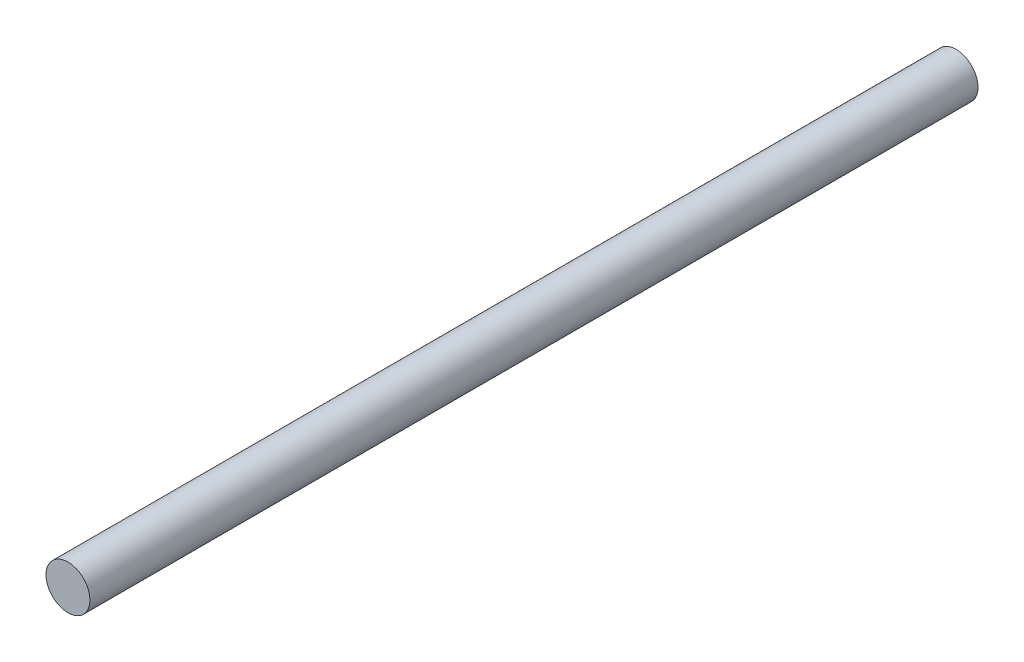
ISO-10303-21;
HEADER;
FILE_DESCRIPTION(('STEP AP214'),'2;1');
FILE_NAME('part.step','',(''),(''),'','','');
FILE_SCHEMA(('AUTOMOTIVE_DESIGN { 1 0 10303 214 1 1 1 1 }'));
ENDSEC;
DATA;
#1=APPLICATION_CONTEXT('core data for automotive mechanical design processes');
#2=APPLICATION_PROTOCOL_DEFINITION('international standard','automotive_design',2000,#1);
#3=PRODUCT_CONTEXT('',#1,'mechanical');
#4=PRODUCT('Part','Part','',(#3));
#5=PRODUCT_RELATED_PRODUCT_CATEGORY('part','',(#4));
#6=PRODUCT_DEFINITION_FORMATION('','',#4);
#7=PRODUCT_DEFINITION_CONTEXT('part definition',#1,'design');
#8=PRODUCT_DEFINITION('design','',#6,#7);
#9=PRODUCT_DEFINITION_SHAPE('','',#8);
#10=(LENGTH_UNIT() NAMED_UNIT(*) SI_UNIT(.MILLI.,.METRE.));
#11=(NAMED_UNIT(*) PLANE_ANGLE_UNIT() SI_UNIT($,.RADIAN.));
#12=(NAMED_UNIT(*) SI_UNIT($,.STERADIAN.) SOLID_ANGLE_UNIT());
#13=UNCERTAINTY_MEASURE_WITH_UNIT(LENGTH_MEASURE(1.E-05),#10,'distance_accuracy_value','');
#14=(GEOMETRIC_REPRESENTATION_CONTEXT(3) GLOBAL_UNCERTAINTY_ASSIGNED_CONTEXT((#13)) GLOBAL_UNIT_ASSIGNED_CONTEXT((#10,
#11,#12)) REPRESENTATION_CONTEXT('',''));
#15=CARTESIAN_POINT('',(0.,0.,0.));
#16=DIRECTION('',(0.,0.,1.));
#17=DIRECTION('',(1.,0.,0.));
#18=AXIS2_PLACEMENT_3D('',#15,#16,#17);
#19=CARTESIAN_POINT('',(0.,0.,101.12));
#20=DIRECTION('',(0.,0.,-1.));
#21=DIRECTION('',(-1.,0.,0.));
#22=AXIS2_PLACEMENT_3D('',#19,#20,#21);
#23=CYLINDRICAL_SURFACE('',#22,2.5);
#24=CARTESIAN_POINT('',(0.,0.,101.12));
#25=DIRECTION('',(0.,0.,1.));
#26=DIRECTION('',(1.,0.,0.));
#27=AXIS2_PLACEMENT_3D('',#24,#25,#26);
#28=CIRCLE('',#27,2.5);
#29=CARTESIAN_POINT('',(-2.5,0.,101.12));
#30=VERTEX_POINT('',#29);
#31=EDGE_CURVE('E10',#30,#30,#28,.T.);
#32=CARTESIAN_POINT('',(0.,0.,0.));
#33=DIRECTION('',(0.,0.,1.));
#34=DIRECTION('',(1.,0.,0.));
#35=AXIS2_PLACEMENT_3D('',#32,#33,#34);
#36=CIRCLE('',#35,2.5);
#37=CARTESIAN_POINT('',(-2.5,0.,0.));
#38=VERTEX_POINT('',#37);
#39=EDGE_CURVE('E33',#38,#38,#36,.T.);
#40=CARTESIAN_POINT('',(-2.5,0.,101.12));
#41=CARTESIAN_POINT('',(-2.5,0.,100.066666666667));
#42=CARTESIAN_POINT('',(-2.5,0.,99.0133333333333));
#43=CARTESIAN_POINT('',(-2.5,0.,96.9066666666667));
#44=CARTESIAN_POINT('',(-2.5,0.,95.8533333333333));
#45=CARTESIAN_POINT('',(-2.5,0.,93.7466666666667));
#46=CARTESIAN_POINT('',(-2.5,0.,92.6933333333333));
#47=CARTESIAN_POINT('',(-2.5,0.,90.5866666666667));
#48=CARTESIAN_POINT('',(-2.5,0.,89.5333333333333));
#49=CARTESIAN_POINT('',(-2.5,0.,87.4266666666667));
#50=CARTESIAN_POINT('',(-2.5,0.,86.3733333333333));
#51=CARTESIAN_POINT('',(-2.5,0.,84.2666666666667));
#52=CARTESIAN_POINT('',(-2.5,0.,83.2133333333333));
#53=CARTESIAN_POINT('',(-2.5,0.,81.1066666666667));
#54=CARTESIAN_POINT('',(-2.5,0.,80.0533333333333));
#55=CARTESIAN_POINT('',(-2.5,0.,77.9466666666667));
#56=CARTESIAN_POINT('',(-2.5,0.,76.8933333333333));
#57=CARTESIAN_POINT('',(-2.5,0.,74.7866666666666));
#58=CARTESIAN_POINT('',(-2.5,0.,73.7333333333333));
#59=CARTESIAN_POINT('',(-2.5,0.,71.6266666666667));
#60=CARTESIAN_POINT('',(-2.5,0.,70.5733333333333));
#61=CARTESIAN_POINT('',(-2.5,0.,68.4666666666667));
#62=CARTESIAN_POINT('',(-2.5,0.,67.4133333333333));
#63=CARTESIAN_POINT('',(-2.5,0.,65.3066666666667));
#64=CARTESIAN_POINT('',(-2.5,0.,64.2533333333333));
#65=CARTESIAN_POINT('',(-2.5,0.,62.1466666666667));
#66=CARTESIAN_POINT('',(-2.5,0.,61.0933333333333));
#67=CARTESIAN_POINT('',(-2.5,0.,58.9866666666667));
#68=CARTESIAN_POINT('',(-2.5,0.,57.9333333333333));
#69=CARTESIAN_POINT('',(-2.5,0.,55.8266666666667));
#70=CARTESIAN_POINT('',(-2.5,0.,54.7733333333333));
#71=CARTESIAN_POINT('',(-2.5,0.,52.6666666666667));
#72=CARTESIAN_POINT('',(-2.5,0.,51.6133333333333));
#73=CARTESIAN_POINT('',(-2.5,0.,49.5066666666667));
#74=CARTESIAN_POINT('',(-2.5,0.,48.4533333333333));
#75=CARTESIAN_POINT('',(-2.5,0.,46.3466666666667));
#76=CARTESIAN_POINT('',(-2.5,0.,45.2933333333333));
#77=CARTESIAN_POINT('',(-2.5,0.,43.1866666666667));
#78=CARTESIAN_POINT('',(-2.5,0.,42.1333333333333));
#79=CARTESIAN_POINT('',(-2.5,0.,40.0266666666667));
#80=CARTESIAN_POINT('',(-2.5,0.,38.9733333333333));
#81=CARTESIAN_POINT('',(-2.5,0.,36.8666666666667));
#82=CARTESIAN_POINT('',(-2.5,0.,35.8133333333333));
#83=CARTESIAN_POINT('',(-2.5,0.,33.7066666666667));
#84=CARTESIAN_POINT('',(-2.5,0.,32.6533333333333));
#85=CARTESIAN_POINT('',(-2.5,0.,30.5466666666667));
#86=CARTESIAN_POINT('',(-2.5,0.,29.4933333333333));
#87=CARTESIAN_POINT('',(-2.5,0.,27.3866666666667));
#88=CARTESIAN_POINT('',(-2.5,0.,26.3333333333333));
#89=CARTESIAN_POINT('',(-2.5,0.,24.2266666666667));
#90=CARTESIAN_POINT('',(-2.5,0.,23.1733333333333));
#91=CARTESIAN_POINT('',(-2.5,0.,21.0666666666667));
#92=CARTESIAN_POINT('',(-2.5,0.,20.0133333333333));
#93=CARTESIAN_POINT('',(-2.5,0.,17.9066666666667));
#94=CARTESIAN_POINT('',(-2.5,0.,16.8533333333333));
#95=CARTESIAN_POINT('',(-2.5,0.,14.7466666666667));
#96=CARTESIAN_POINT('',(-2.5,0.,13.6933333333333));
#97=CARTESIAN_POINT('',(-2.5,0.,11.5866666666667));
#98=CARTESIAN_POINT('',(-2.5,0.,10.5333333333333));
#99=CARTESIAN_POINT('',(-2.5,0.,8.42666666666667));
#100=CARTESIAN_POINT('',(-2.5,0.,7.37333333333334));
#101=CARTESIAN_POINT('',(-2.5,0.,5.26666666666667));
#102=CARTESIAN_POINT('',(-2.5,0.,4.21333333333333));
#103=CARTESIAN_POINT('',(-2.5,0.,2.10666666666666));
#104=CARTESIAN_POINT('',(-2.5,0.,1.05333333333333));
#105=CARTESIAN_POINT('',(-2.5,0.,0.));
#106=B_SPLINE_CURVE_WITH_KNOTS('',3,(#40,#41,#42,#43,#44,#45,#46,#47,#48,#49,#50,#51,#52,#53,
#54,#55,#56,#57,#58,#59,#60,#61,#62,#63,#64,#65,#66,#67,#68,#69,#70,#71,#72,#73,#74,#75,#76,#77,
#78,#79,#80,#81,#82,#83,#84,#85,#86,#87,#88,#89,#90,#91,#92,#93,#94,#95,#96,#97,#98,#99,#100,
#101,#102,#103,#104,#105),.UNSPECIFIED.,.F.,.F.,(4,2,2,2,2,2,2,2,2,2,2,2,2,2,2,2,2,2,2,2,2,2,2,
2,2,2,2,2,2,2,2,2,4),(0.,3.16,6.31999999999999,9.47999999999999,12.64,15.8,18.96,22.12,25.28,
28.44,31.6,34.76,37.92,41.08,44.24,47.4,50.56,53.72,56.88,60.04,63.2,66.36,69.52,72.68,75.84,
79.,82.16,85.32,88.48,91.64,94.8,97.96,101.12),.UNSPECIFIED.);
#107=EDGE_CURVE('BSEAM30',#30,#38,#106,.T.);
#108=ORIENTED_EDGE('',*,*,#31,.F.);
#109=ORIENTED_EDGE('',*,*,#39,.T.);
#110=ORIENTED_EDGE('',*,*,#107,.T.);
#111=ORIENTED_EDGE('',*,*,#107,.F.);
#112=EDGE_LOOP('',(#108,#110,#109,#111));
#113=FACE_BOUND('',#112,.T.);
#114=ADVANCED_FACE('F30',(#113),#23,.T.);
#115=CARTESIAN_POINT('',(0.,0.,101.12));
#116=DIRECTION('',(0.,0.,1.));
#117=DIRECTION('',(1.,0.,0.));
#118=AXIS2_PLACEMENT_3D('',#115,#116,#117);
#119=PLANE('',#118);
#120=ORIENTED_EDGE('',*,*,#31,.T.);
#121=EDGE_LOOP('',(#120));
#122=FACE_BOUND('',#121,.T.);
#123=ADVANCED_FACE('F45',(#122),#119,.T.);
#124=CARTESIAN_POINT('',(0.,0.,0.));
#125=DIRECTION('',(0.,0.,1.));
#126=DIRECTION('',(1.,0.,0.));
#127=AXIS2_PLACEMENT_3D('',#124,#125,#126);
#128=PLANE('',#127);
#129=ORIENTED_EDGE('',*,*,#39,.F.);
#130=EDGE_LOOP('',(#129));
#131=FACE_BOUND('',#130,.T.);
#132=ADVANCED_FACE('F43',(#131),#128,.F.);
#133=CLOSED_SHELL('',(#114,#123,#132));
#134=MANIFOLD_SOLID_BREP('B2',#133);
#135=ADVANCED_BREP_SHAPE_REPRESENTATION('',(#18,#134),#14);
#136=SHAPE_DEFINITION_REPRESENTATION(#9,#135);
ENDSEC;
END-ISO-10303-21;
